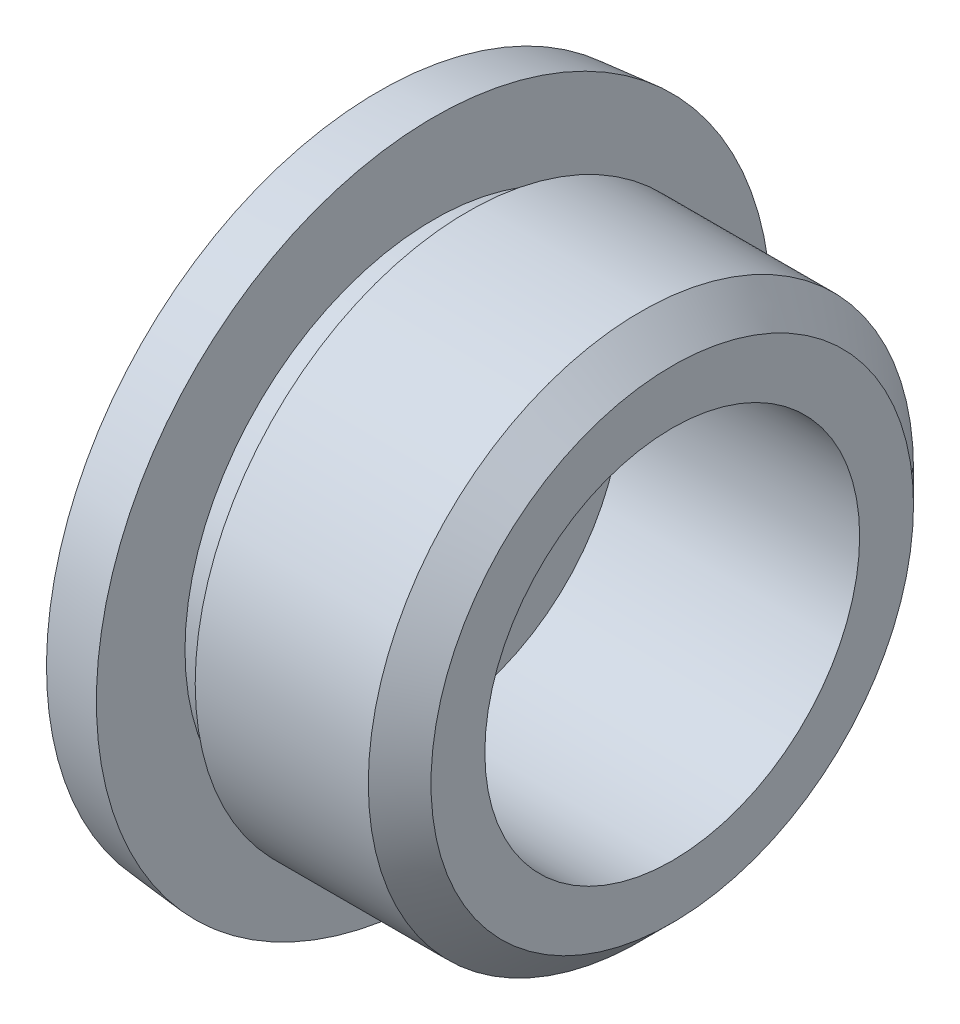
ISO-10303-21;
HEADER;
FILE_DESCRIPTION(('STEP AP214'),'2;1');
FILE_NAME('part.step','',(''),(''),'','','');
FILE_SCHEMA(('AUTOMOTIVE_DESIGN { 1 0 10303 214 1 1 1 1 }'));
ENDSEC;
DATA;
#1=APPLICATION_CONTEXT('core data for automotive mechanical design processes');
#2=APPLICATION_PROTOCOL_DEFINITION('international standard','automotive_design',2000,#1);
#3=PRODUCT_CONTEXT('',#1,'mechanical');
#4=PRODUCT('Part','Part','',(#3));
#5=PRODUCT_RELATED_PRODUCT_CATEGORY('part','',(#4));
#6=PRODUCT_DEFINITION_FORMATION('','',#4);
#7=PRODUCT_DEFINITION_CONTEXT('part definition',#1,'design');
#8=PRODUCT_DEFINITION('design','',#6,#7);
#9=PRODUCT_DEFINITION_SHAPE('','',#8);
#10=(LENGTH_UNIT() NAMED_UNIT(*) SI_UNIT(.MILLI.,.METRE.));
#11=(NAMED_UNIT(*) PLANE_ANGLE_UNIT() SI_UNIT($,.RADIAN.));
#12=(NAMED_UNIT(*) SI_UNIT($,.STERADIAN.) SOLID_ANGLE_UNIT());
#13=UNCERTAINTY_MEASURE_WITH_UNIT(LENGTH_MEASURE(1.E-05),#10,'distance_accuracy_value','');
#14=(GEOMETRIC_REPRESENTATION_CONTEXT(3) GLOBAL_UNCERTAINTY_ASSIGNED_CONTEXT((#13)) GLOBAL_UNIT_ASSIGNED_CONTEXT((#10,
#11,#12)) REPRESENTATION_CONTEXT('',''));
#15=CARTESIAN_POINT('',(0.,0.,0.));
#16=DIRECTION('',(0.,0.,1.));
#17=DIRECTION('',(1.,0.,0.));
#18=AXIS2_PLACEMENT_3D('',#15,#16,#17);
#19=CARTESIAN_POINT('',(25.0000000000068,-8.09248501543181E-13,0.));
#20=DIRECTION('',(1.,0.,0.));
#21=DIRECTION('',(0.,1.,0.));
#22=AXIS2_PLACEMENT_3D('',#19,#20,#21);
#23=SPHERICAL_SURFACE('',#22,35.0000000000068);
#24=CARTESIAN_POINT('',(-9.63740752423606,-0.500000000000008,5.));
#25=CARTESIAN_POINT('',(-9.63981327566375,-0.333342014793508,5.));
#26=CARTESIAN_POINT('',(-9.6410161513776,-0.166675348127109,5.));
#27=CARTESIAN_POINT('',(-9.6410161513776,0.166675348126021,5.));
#28=CARTESIAN_POINT('',(-9.63981327566374,0.333342014792958,5.));
#29=CARTESIAN_POINT('',(-9.63740752423603,0.499999999999996,5.));
#30=B_SPLINE_CURVE_WITH_KNOTS('',3,(#24,#25,#26,#27,#28,#29),.UNSPECIFIED.,.F.,.F.,(4,2,4),
(3.12715839564098,3.14159265358979,3.15602691153865),.UNSPECIFIED.);
#31=CARTESIAN_POINT('',(-9.63740752423607,-0.5,5.));
#32=VERTEX_POINT('',#31);
#33=CARTESIAN_POINT('',(-9.63740752423605,0.5,5.));
#34=VERTEX_POINT('',#33);
#35=EDGE_CURVE('E91',#32,#34,#30,.T.);
#36=ORIENTED_EDGE('',*,*,#35,.F.);
#37=CARTESIAN_POINT('',(-9.69510051863642,-0.999999999999999,4.50000000019122));
#38=CARTESIAN_POINT('',(-9.69425625040718,-1.00000006529905,4.50650932859504));
#39=CARTESIAN_POINT('',(-9.69341378455606,-0.999872888323441,4.51301888935069));
#40=CARTESIAN_POINT('',(-9.69173368959756,-0.999364463580699,4.52602870416813));
#41=CARTESIAN_POINT('',(-9.69089606048843,-0.998983215906208,4.53252895823331));
#42=CARTESIAN_POINT('',(-9.68922687187862,-0.997967064432838,4.54551038140945));
#43=CARTESIAN_POINT('',(-9.68839531236708,-0.997332161088237,4.55199155055457));
#44=CARTESIAN_POINT('',(-9.68673949592925,-0.995809575434961,4.56492504867621));
#45=CARTESIAN_POINT('',(-9.68591523898333,-0.994921893805845,4.57137737773021));
#46=CARTESIAN_POINT('',(-9.6842752606,-0.99289496692795,4.58424347450375));
#47=CARTESIAN_POINT('',(-9.68345953913741,-0.991755722421185,4.59065724233696));
#48=CARTESIAN_POINT('',(-9.68183786474035,-0.989227255250642,4.60343654303009));
#49=CARTESIAN_POINT('',(-9.68103191178179,-0.987838033203643,4.60980207600896));
#50=CARTESIAN_POINT('',(-9.67943100705672,-0.984811556093248,4.62247529361749));
#51=CARTESIAN_POINT('',(-9.67863605527774,-0.983174301311169,4.62878297831274));
#52=CARTESIAN_POINT('',(-9.67705838685718,-0.979654063820976,4.64133095930795));
#53=CARTESIAN_POINT('',(-9.67627567022977,-0.977771080828532,4.64757125552993));
#54=CARTESIAN_POINT('',(-9.67472370313987,-0.973762054175431,4.65997498975607));
#55=CARTESIAN_POINT('',(-9.67395445270483,-0.971636010019482,4.66613842760359));
#56=CARTESIAN_POINT('',(-9.67243070747204,-0.967143950675864,4.678378894743));
#57=CARTESIAN_POINT('',(-9.67167621229209,-0.964777941713751,4.68445592627194));
#58=CARTESIAN_POINT('',(-9.67018304166208,-0.95980937569266,4.69651427268231));
#59=CARTESIAN_POINT('',(-9.66944436574704,-0.957206825598449,4.70249559037586));
#60=CARTESIAN_POINT('',(-9.66798390572873,-0.951768929405653,4.7143533952469));
#61=CARTESIAN_POINT('',(-9.66726212126381,-0.948933588297169,4.7202298846682));
#62=CARTESIAN_POINT('',(-9.66583651180424,-0.943034205706543,4.73186905855125));
#63=CARTESIAN_POINT('',(-9.66513268659146,-0.939970167003871,4.73763174439503));
#64=CARTESIAN_POINT('',(-9.66374406462611,-0.933617823427196,4.74903448925447));
#65=CARTESIAN_POINT('',(-9.66305926784466,-0.930329518893538,4.7546745484562));
#66=CARTESIAN_POINT('',(-9.66170977058081,-0.923533411298078,4.76582338280248));
#67=CARTESIAN_POINT('',(-9.66104507031054,-0.920025605920577,4.77133215656115));
#68=CARTESIAN_POINT('',(-9.6597368368979,-0.912795591838756,4.78220993990732));
#69=CARTESIAN_POINT('',(-9.6590933042668,-0.909073377961649,4.78757894611826));
#70=CARTESIAN_POINT('',(-9.65782846583261,-0.90141996439581,4.79816890235774));
#71=CARTESIAN_POINT('',(-9.65720716090437,-0.897488756496561,4.80338984655716));
#72=CARTESIAN_POINT('',(-9.65598789544649,-0.889423195636813,4.81367544949314));
#73=CARTESIAN_POINT('',(-9.65538993558901,-0.885288836834814,4.81874010372883));
#74=CARTESIAN_POINT('',(-9.65421837050112,-0.876823449280919,4.82870476909937));
#75=CARTESIAN_POINT('',(-9.65364476405658,-0.872492430355895,4.83360478843958));
#76=CARTESIAN_POINT('',(-9.65252265411781,-0.863640208944243,4.84323251649939));
#77=CARTESIAN_POINT('',(-9.65197414956924,-0.859119014460857,4.84796023245452));
#78=CARTESIAN_POINT('',(-9.65090303136803,-0.849893188078305,4.85723597900052));
#79=CARTESIAN_POINT('',(-9.65038041707609,-0.845188560713695,4.8617840140276));
#80=CARTESIAN_POINT('',(-9.64936185540236,-0.835602899670582,4.87069328082037));
#81=CARTESIAN_POINT('',(-9.64886590786192,-0.830721867041878,4.8750545136974));
#82=CARTESIAN_POINT('',(-9.64790145831003,-0.820790701221015,4.88358332703785));
#83=CARTESIAN_POINT('',(-9.64743295669015,-0.81574056561784,4.88775090473819));
#84=CARTESIAN_POINT('',(-9.64652417871292,-0.805478764449239,4.89588583760548));
#85=CARTESIAN_POINT('',(-9.64608390337163,-0.800267093078999,4.89985318556366));
#86=CARTESIAN_POINT('',(-9.64523235019704,-0.789690046027472,4.90758137774001));
#87=CARTESIAN_POINT('',(-9.64482107408278,-0.784324661260706,4.91134220971325));
#88=CARTESIAN_POINT('',(-9.64402832000042,-0.773448255526343,4.91865138863502));
#89=CARTESIAN_POINT('',(-9.64364684453966,-0.767937222356359,4.92219971769826));
#90=CARTESIAN_POINT('',(-9.64291452765467,-0.756779987515788,4.92907688227806));
#91=CARTESIAN_POINT('',(-9.64256367778062,-0.751133823680066,4.93240577827538));
#92=CARTESIAN_POINT('',(-9.64189307354491,-0.739716341022641,4.93883822647942));
#93=CARTESIAN_POINT('',(-9.64157330430276,-0.733945083726809,4.94194188634037));
#94=CARTESIAN_POINT('',(-9.64096523235172,-0.722285089557511,4.94791991696799));
#95=CARTESIAN_POINT('',(-9.64067692232856,-0.716396380369748,4.95079434098986));
#96=CARTESIAN_POINT('',(-9.64013211206196,-0.704509228339795,4.95631010093332));
#97=CARTESIAN_POINT('',(-9.63987561233846,-0.698510783705751,4.95895143304469));
#98=CARTESIAN_POINT('',(-9.63939477307574,-0.68641198214126,4.96399735444876));
#99=CARTESIAN_POINT('',(-9.63917044213067,-0.680311598461163,4.96640188042321));
#100=CARTESIAN_POINT('',(-9.63875428844859,-0.668016823309242,4.970970676567));
#101=CARTESIAN_POINT('',(-9.63856248260284,-0.661822384800202,4.97313482169938));
#102=CARTESIAN_POINT('',(-9.63821172811189,-0.649347495063908,4.97721948375238));
#103=CARTESIAN_POINT('',(-9.63805280486026,-0.643066981326151,4.97913981194666));
#104=CARTESIAN_POINT('',(-9.63776816176221,-0.630428034850593,4.98273360808912));
#105=CARTESIAN_POINT('',(-9.63764247599443,-0.624069529080691,4.98440682189921));
#106=CARTESIAN_POINT('',(-9.63742465816906,-0.611282509912527,4.98750336830185));
#107=CARTESIAN_POINT('',(-9.63733257057521,-0.604853915255748,4.98892636848209));
#108=CARTESIAN_POINT('',(-9.63718234881359,-0.591934524830936,4.99151960655484));
#109=CARTESIAN_POINT('',(-9.63712427086009,-0.585443644004222,4.99268942396322));
#110=CARTESIAN_POINT('',(-9.637042056262,-0.572412551834939,4.99477268746107));
#111=CARTESIAN_POINT('',(-9.6370179610222,-0.565872290058695,4.99568581972121));
#112=CARTESIAN_POINT('',(-9.63700379527405,-0.552756297167026,4.99725287844416));
#113=CARTESIAN_POINT('',(-9.63701374761082,-0.546180545193489,4.99790663054065));
#114=CARTESIAN_POINT('',(-9.63706773427613,-0.533007605018115,4.99895305711112));
#115=CARTESIAN_POINT('',(-9.63711177290912,-0.526410414213753,4.99934569860022));
#116=CARTESIAN_POINT('',(-9.63723401461519,-0.51320873187845,4.99986915479854));
#117=CARTESIAN_POINT('',(-9.63731220340443,-0.506604244550177,5.00000007884758));
#118=CARTESIAN_POINT('',(-9.63740752423536,-0.500000000050684,4.99999999999996));
#119=B_SPLINE_CURVE_WITH_KNOTS('',3,(#37,#38,#39,#40,#41,#42,#43,#44,#45,#46,#47,#48,#49,#50,
#51,#52,#53,#54,#55,#56,#57,#58,#59,#60,#61,#62,#63,#64,#65,#66,#67,#68,#69,#70,#71,#72,#73,#74,
#75,#76,#77,#78,#79,#80,#81,#82,#83,#84,#85,#86,#87,#88,#89,#90,#91,#92,#93,#94,#95,#96,#97,#98,
#99,#100,#101,#102,#103,#104,#105,#106,#107,#108,#109,#110,#111,#112,#113,#114,#115,#116,#117,
#118),.UNSPECIFIED.,.F.,.F.,(4,2,2,2,2,2,2,2,2,2,2,2,2,2,2,2,2,2,2,2,2,2,2,2,2,2,2,2,2,2,2,2,2,
2,2,2,2,2,2,2,4),(0.,0.0196903202776409,0.039380633375157,0.0590709112088306,0.078761136108381,
0.0984513029301344,0.118141421170296,0.137831517078234,0.157521635769625,0.177211794584777,
0.196901442696451,0.216590511249746,0.23627915785897,0.255967565221772,0.27565594270612,
0.295344527934721,0.315033588366225,0.334723422872513,0.35441382388164,0.374103242065324,
0.393791832477795,0.413479936486441,0.433167923349381,0.452856191036952,0.472545167047633,
0.492235309217705,0.511927106285365,0.53161345295166,0.551290327467236,0.570962617328966,
0.590635228703609,0.610313086026817,0.630001131556556,0.649704324882489,0.669427642393108,
0.689176967822479,0.708958845291023,0.728764804389769,0.748584055424387,0.768405809655432,
0.788219281058291),.UNSPECIFIED.);
#120=CARTESIAN_POINT('',(-9.69510051866122,-1.,4.5));
#121=VERTEX_POINT('',#120);
#122=EDGE_CURVE('E79',#121,#32,#119,.T.);
#123=ORIENTED_EDGE('',*,*,#122,.F.);
#124=CARTESIAN_POINT('',(-9.69510051866118,-1.,-4.5));
#125=CARTESIAN_POINT('',(-9.88884108560159,-1.,-3.00625590121306));
#126=CARTESIAN_POINT('',(-9.9857113690718,-1.,-1.50625590121306));
#127=CARTESIAN_POINT('',(-9.9857113690718,-1.,1.50625590121306));
#128=CARTESIAN_POINT('',(-9.88884108560159,-1.,3.00625590121306));
#129=CARTESIAN_POINT('',(-9.69510051866118,-1.,4.5));
#130=B_SPLINE_CURVE_WITH_KNOTS('',3,(#124,#125,#126,#127,#128,#129),.UNSPECIFIED.,.F.,.F.,(4,2,
4),(1.44181505964026,1.5707963267949,1.69977759394954),.UNSPECIFIED.);
#131=CARTESIAN_POINT('',(-9.69510051866122,-1.,-4.5));
#132=VERTEX_POINT('',#131);
#133=EDGE_CURVE('E95',#132,#121,#130,.T.);
#134=ORIENTED_EDGE('',*,*,#133,.F.);
#135=CARTESIAN_POINT('',(-9.6374075242347,-0.500000000000038,-4.99999999999996));
#136=CARTESIAN_POINT('',(-9.63731277104187,-0.506563964563976,-5.00000007691213));
#137=CARTESIAN_POINT('',(-9.63723496527496,-0.513128169230701,-4.999870745952));
#138=CARTESIAN_POINT('',(-9.63711318464813,-0.526246132393621,-4.99935378556004));
#139=CARTESIAN_POINT('',(-9.6370692067935,-0.532799891763242,-4.99896617899846));
#140=CARTESIAN_POINT('',(-9.63701500292803,-0.545886809092196,-4.99793321567878));
#141=CARTESIAN_POINT('',(-9.63700477488075,-0.552419968270767,-4.99728787447488));
#142=CARTESIAN_POINT('',(-9.63701799046357,-0.565455568380148,-4.99574050269229));
#143=CARTESIAN_POINT('',(-9.63704143300549,-0.571958010296882,-4.99483848040991));
#144=CARTESIAN_POINT('',(-9.63712191018678,-0.584922107863202,-4.99277917259451));
#145=CARTESIAN_POINT('',(-9.63717894467586,-0.59138376369514,-4.99162188820358));
#146=CARTESIAN_POINT('',(-9.63732652498977,-0.604256286736955,-4.98905388424459));
#147=CARTESIAN_POINT('',(-9.63741707159157,-0.61066715276576,-4.98764315880095));
#148=CARTESIAN_POINT('',(-9.6376315995727,-0.623428174328837,-4.98457048944334));
#149=CARTESIAN_POINT('',(-9.63775558264556,-0.629778326771115,-4.98290853280649));
#150=CARTESIAN_POINT('',(-9.63803689144162,-0.642408095638793,-4.97933600547671));
#151=CARTESIAN_POINT('',(-9.63819421976281,-0.648687706528002,-4.97742541541674));
#152=CARTESIAN_POINT('',(-9.63854218030399,-0.661166505035479,-4.97335866500138));
#153=CARTESIAN_POINT('',(-9.63873281510801,-0.667365686373625,-4.97120248559682));
#154=CARTESIAN_POINT('',(-9.63914702772075,-0.679673061722857,-4.96664830601113));
#155=CARTESIAN_POINT('',(-9.63937060367585,-0.685781260832264,-4.96425031943898));
#156=CARTESIAN_POINT('',(-9.63985012713989,-0.697897128651814,-4.95921646038743));
#157=CARTESIAN_POINT('',(-9.64010607277855,-0.703904803147464,-4.95658060165454));
#158=CARTESIAN_POINT('',(-9.6406498181426,-0.715810407749626,-4.95107524818149));
#159=CARTESIAN_POINT('',(-9.64093761676805,-0.721708341637467,-4.94820576150983));
#160=CARTESIAN_POINT('',(-9.64154453729567,-0.733385431460395,-4.94223775589454));
#161=CARTESIAN_POINT('',(-9.64186365880764,-0.73916458887399,-4.93913923980404));
#162=CARTESIAN_POINT('',(-9.64253269772988,-0.750595285599569,-4.9327181254545));
#163=CARTESIAN_POINT('',(-9.64288261540067,-0.75624682383141,-4.9293955252998));
#164=CARTESIAN_POINT('',(-9.64361271924159,-0.767413648667125,-4.9225315311684));
#165=CARTESIAN_POINT('',(-9.64399290626632,-0.772928931418249,-4.91899013101482));
#166=CARTESIAN_POINT('',(-9.64478301841711,-0.7838148313534,-4.91169415474897));
#167=CARTESIAN_POINT('',(-9.64519294493736,-0.789185441738914,-4.90793956864423));
#168=CARTESIAN_POINT('',(-9.64604201803457,-0.799773814269035,-4.90022315925324));
#169=CARTESIAN_POINT('',(-9.64648116649389,-0.804991566535964,-4.89626132262037));
#170=CARTESIAN_POINT('',(-9.6473880862412,-0.81526591156352,-4.88813695686628));
#171=CARTESIAN_POINT('',(-9.64785585775849,-0.820322503032599,-4.88397442613738));
#172=CARTESIAN_POINT('',(-9.64881906484518,-0.830266551347629,-4.87545554582889));
#173=CARTESIAN_POINT('',(-9.64931449910687,-0.835154016171109,-4.87109920541331));
#174=CARTESIAN_POINT('',(-9.65033214633188,-0.844752497286065,-4.86219959654842));
#175=CARTESIAN_POINT('',(-9.6508543584383,-0.849463519215495,-4.85765633408164));
#176=CARTESIAN_POINT('',(-9.65192466403368,-0.858702080334872,-4.84839004089201));
#177=CARTESIAN_POINT('',(-9.65247275704623,-0.863229622899459,-4.84366701347857));
#178=CARTESIAN_POINT('',(-9.65359393065792,-0.8720944796052,-4.83404860850138));
#179=CARTESIAN_POINT('',(-9.65416701109613,-0.876431794971116,-4.82915323204765));
#180=CARTESIAN_POINT('',(-9.65533726405428,-0.884909749537635,-4.81919779371308));
#181=CARTESIAN_POINT('',(-9.65593443666957,-0.88905038795963,-4.81413773118043));
#182=CARTESIAN_POINT('',(-9.65715198217051,-0.897128847273778,-4.80386082066884));
#183=CARTESIAN_POINT('',(-9.65777235535413,-0.901066665559472,-4.79864397067638));
#184=CARTESIAN_POINT('',(-9.65903539746182,-0.908733658713315,-4.78806160694129));
#185=CARTESIAN_POINT('',(-9.65967806683789,-0.912462829347659,-4.78269609018526));
#186=CARTESIAN_POINT('',(-9.66098479720044,-0.919706760402931,-4.77182512121643));
#187=CARTESIAN_POINT('',(-9.66164885720675,-0.923221530626861,-4.76631967541792));
#188=CARTESIAN_POINT('',(-9.6629969431483,-0.930030217395032,-4.75517956188308));
#189=CARTESIAN_POINT('',(-9.66368096033667,-0.933324228667277,-4.7495449509828));
#190=CARTESIAN_POINT('',(-9.66506791853393,-0.939687253885697,-4.73815470181056));
#191=CARTESIAN_POINT('',(-9.66577085357618,-0.942756337662383,-4.73239910182083));
#192=CARTESIAN_POINT('',(-9.66719466921088,-0.948665886467429,-4.72077461578409));
#193=CARTESIAN_POINT('',(-9.66791554801332,-0.951506374181158,-4.71490574105007));
#194=CARTESIAN_POINT('',(-9.66937427230262,-0.956955267051686,-4.70306249507446));
#195=CARTESIAN_POINT('',(-9.67011211967652,-0.959563646237526,-4.6970881121168));
#196=CARTESIAN_POINT('',(-9.67160380312127,-0.964545011671489,-4.68504169355398));
#197=CARTESIAN_POINT('',(-9.67235764425614,-0.966917921972261,-4.67896962717143));
#198=CARTESIAN_POINT('',(-9.6738803373259,-0.971425189524726,-4.66673574611351));
#199=CARTESIAN_POINT('',(-9.67464919700225,-0.973559419719333,-4.66057388559191));
#200=CARTESIAN_POINT('',(-9.67620095102578,-0.977586314928434,-4.64816838797042));
#201=CARTESIAN_POINT('',(-9.67698385529491,-0.979478800825686,-4.64192469397056));
#202=CARTESIAN_POINT('',(-9.67856271820882,-0.983019342162114,-4.62936357481892));
#203=CARTESIAN_POINT('',(-9.67935868845682,-0.984667165653447,-4.62304608574906));
#204=CARTESIAN_POINT('',(-9.6809628180079,-0.987715847391021,-4.6103447367161));
#205=CARTESIAN_POINT('',(-9.68177099147673,-0.989116390087548,-4.60396080280257));
#206=CARTESIAN_POINT('',(-9.68339828933468,-0.991667605311439,-4.59113597943397));
#207=CARTESIAN_POINT('',(-9.68421742639107,-0.992817956446248,-4.58469502765322));
#208=CARTESIAN_POINT('',(-9.68586504741001,-0.994865783630317,-4.5717684812532));
#209=CARTESIAN_POINT('',(-9.68669353879217,-0.995763041769939,-4.56528285305933));
#210=CARTESIAN_POINT('',(-9.68835826917983,-0.997302465774662,-4.55227946120207));
#211=CARTESIAN_POINT('',(-9.68919451141449,-0.997944519932422,-4.54576168472776));
#212=CARTESIAN_POINT('',(-9.69087314061317,-0.998972088709345,-4.53270662361423));
#213=CARTESIAN_POINT('',(-9.69171552767637,-0.999357599178613,-4.52616933866114));
#214=CARTESIAN_POINT('',(-9.69340484461117,-0.999871536147144,-4.51308795503908));
#215=CARTESIAN_POINT('',(-9.6942517725036,-1.00000006676009,-4.50654386020467));
#216=CARTESIAN_POINT('',(-9.69510051865333,-1.,-4.50000000006086));
#217=B_SPLINE_CURVE_WITH_KNOTS('',3,(#135,#136,#137,#138,#139,#140,#141,#142,#143,#144,#145,
#146,#147,#148,#149,#150,#151,#152,#153,#154,#155,#156,#157,#158,#159,#160,#161,#162,#163,#164,
#165,#166,#167,#168,#169,#170,#171,#172,#173,#174,#175,#176,#177,#178,#179,#180,#181,#182,#183,
#184,#185,#186,#187,#188,#189,#190,#191,#192,#193,#194,#195,#196,#197,#198,#199,#200,#201,#202,
#203,#204,#205,#206,#207,#208,#209,#210,#211,#212,#213,#214,#215,#216),.UNSPECIFIED.,.F.,.F.,(4,
2,2,2,2,2,2,2,2,2,2,2,2,2,2,2,2,2,2,2,2,2,2,2,2,2,2,2,2,2,2,2,2,2,2,2,2,2,2,2,4),(0.,
0.0196926429646662,0.0393835423821486,0.0590732536398859,0.0787623285692141,0.0984513154070089,
0.118140758758321,0.137831199560027,0.157523175045485,0.177216678981782,0.196909075180842,
0.216600334095412,0.236290913247631,0.25598124714631,0.27567174763752,0.295362804260076,
0.31505478460553,0.33474803465047,0.354441442478171,0.374133920118487,0.393825767979081,
0.413517253493452,0.433208612207305,0.452900048869105,0.472591738524105,0.492283827611242,
0.511975015643729,0.531657699328988,0.551334246254693,0.571008838109244,0.590685628621613,
0.610368745132079,0.630062290217596,0.649770343366257,0.669496962695211,0.68924857561287,
0.709025413245157,0.728819226851449,0.748621695047495,0.768424483563975,0.788219247485347),.UNSPECIFIED.);
#218=CARTESIAN_POINT('',(-9.63740752423607,-0.5,-5.));
#219=VERTEX_POINT('',#218);
#220=EDGE_CURVE('E163',#219,#132,#217,.T.);
#221=ORIENTED_EDGE('',*,*,#220,.F.);
#222=CARTESIAN_POINT('',(-9.63740752423603,0.499999999999994,-5.));
#223=CARTESIAN_POINT('',(-9.63981327566374,0.33334201479296,-5.));
#224=CARTESIAN_POINT('',(-9.6410161513776,0.166675348126029,-5.));
#225=CARTESIAN_POINT('',(-9.6410161513776,-0.166675348127097,-5.));
#226=CARTESIAN_POINT('',(-9.63981327566375,-0.333342014793495,-5.));
#227=CARTESIAN_POINT('',(-9.63740752423606,-0.499999999999995,-5.));
#228=B_SPLINE_CURVE_WITH_KNOTS('',3,(#222,#223,#224,#225,#226,#227),.UNSPECIFIED.,.F.,.F.,(4,2,
4),(6.26875104923073,6.28318530717959,6.2976195651284),.UNSPECIFIED.);
#229=CARTESIAN_POINT('',(-9.63740752423606,0.5,-5.));
#230=VERTEX_POINT('',#229);
#231=EDGE_CURVE('E167',#230,#219,#228,.T.);
#232=ORIENTED_EDGE('',*,*,#231,.F.);
#233=CARTESIAN_POINT('',(-9.69510051863638,0.999999999999999,-4.50000000019118));
#234=CARTESIAN_POINT('',(-9.69425625040714,1.00000006529905,-4.506509328595));
#235=CARTESIAN_POINT('',(-9.69341378455601,0.999872888323442,-4.51301888935065));
#236=CARTESIAN_POINT('',(-9.69173368959752,0.9993644635807,-4.52602870416809));
#237=CARTESIAN_POINT('',(-9.69089606048838,0.998983215906211,-4.53252895823327));
#238=CARTESIAN_POINT('',(-9.68922687187858,0.997967064432841,-4.54551038140942));
#239=CARTESIAN_POINT('',(-9.68839531236704,0.99733216108824,-4.55199155055454));
#240=CARTESIAN_POINT('',(-9.6867394959292,0.995809575434964,-4.56492504867618));
#241=CARTESIAN_POINT('',(-9.68591523898329,0.994921893805849,-4.57137737773018));
#242=CARTESIAN_POINT('',(-9.68427526059995,0.992894966927955,-4.58424347450372));
#243=CARTESIAN_POINT('',(-9.68345953913737,0.99175572242119,-4.59065724233694));
#244=CARTESIAN_POINT('',(-9.68183786474031,0.989227255250647,-4.60343654303006));
#245=CARTESIAN_POINT('',(-9.68103191178174,0.987838033203648,-4.60980207600894));
#246=CARTESIAN_POINT('',(-9.67943100705667,0.984811556093253,-4.62247529361747));
#247=CARTESIAN_POINT('',(-9.6786360552777,0.983174301311174,-4.62878297831272));
#248=CARTESIAN_POINT('',(-9.67705838685714,0.979654063820981,-4.64133095930793));
#249=CARTESIAN_POINT('',(-9.67627567022972,0.977771080828537,-4.64757125552992));
#250=CARTESIAN_POINT('',(-9.67472370313982,0.973762054175436,-4.65997498975606));
#251=CARTESIAN_POINT('',(-9.67395445270479,0.971636010019488,-4.66613842760357));
#252=CARTESIAN_POINT('',(-9.672430707472,0.96714395067587,-4.67837889474299));
#253=CARTESIAN_POINT('',(-9.67167621229204,0.964777941713756,-4.68445592627192));
#254=CARTESIAN_POINT('',(-9.67018304166204,0.959809375692666,-4.69651427268229));
#255=CARTESIAN_POINT('',(-9.66944436574699,0.957206825598454,-4.70249559037585));
#256=CARTESIAN_POINT('',(-9.66798390572869,0.951768929405658,-4.71435339524689));
#257=CARTESIAN_POINT('',(-9.66726212126377,0.948933588297173,-4.72022988466819));
#258=CARTESIAN_POINT('',(-9.6658365118042,0.943034205706547,-4.73186905855124));
#259=CARTESIAN_POINT('',(-9.66513268659142,0.939970167003875,-4.73763174439503));
#260=CARTESIAN_POINT('',(-9.66374406462607,0.933617823427198,-4.74903448925446));
#261=CARTESIAN_POINT('',(-9.66305926784462,0.93032951889354,-4.75467454845619));
#262=CARTESIAN_POINT('',(-9.66170977058077,0.923533411298079,-4.76582338280248));
#263=CARTESIAN_POINT('',(-9.6610450703105,0.920025605920578,-4.77133215656115));
#264=CARTESIAN_POINT('',(-9.65973683689786,0.912795591838756,-4.78220993990732));
#265=CARTESIAN_POINT('',(-9.65909330426676,0.909073377961648,-4.78757894611826));
#266=CARTESIAN_POINT('',(-9.65782846583258,0.901419964395809,-4.79816890235775));
#267=CARTESIAN_POINT('',(-9.65720716090433,0.897488756496559,-4.80338984655716));
#268=CARTESIAN_POINT('',(-9.65598789544645,0.889423195636811,-4.81367544949314));
#269=CARTESIAN_POINT('',(-9.65538993558897,0.885288836834811,-4.81874010372884));
#270=CARTESIAN_POINT('',(-9.65421837050109,0.876823449280915,-4.82870476909937));
#271=CARTESIAN_POINT('',(-9.65364476405654,0.872492430355892,-4.83360478843958));
#272=CARTESIAN_POINT('',(-9.65252265411777,0.86364020894424,-4.8432325164994));
#273=CARTESIAN_POINT('',(-9.6519741495692,0.859119014460853,-4.84796023245453));
#274=CARTESIAN_POINT('',(-9.65090303136799,0.849893188078302,-4.85723597900052));
#275=CARTESIAN_POINT('',(-9.65038041707605,0.845188560713691,-4.8617840140276));
#276=CARTESIAN_POINT('',(-9.64936185540233,0.835602899670579,-4.87069328082037));
#277=CARTESIAN_POINT('',(-9.64886590786189,0.830721867041875,-4.8750545136974));
#278=CARTESIAN_POINT('',(-9.64790145830999,0.820790701221012,-4.88358332703786));
#279=CARTESIAN_POINT('',(-9.64743295669012,0.815740565617838,-4.88775090473819));
#280=CARTESIAN_POINT('',(-9.64652417871288,0.805478764449237,-4.89588583760549));
#281=CARTESIAN_POINT('',(-9.64608390337159,0.800267093078998,-4.89985318556366));
#282=CARTESIAN_POINT('',(-9.64523235019701,0.789690046027471,-4.90758137774001));
#283=CARTESIAN_POINT('',(-9.64482107408275,0.784324661260705,-4.91134220971325));
#284=CARTESIAN_POINT('',(-9.64402832000038,0.773448255526342,-4.91865138863502));
#285=CARTESIAN_POINT('',(-9.64364684453962,0.767937222356358,-4.92219971769826));
#286=CARTESIAN_POINT('',(-9.64291452765464,0.756779987515925,-4.92907688227797));
#287=CARTESIAN_POINT('',(-9.64256367778059,0.751133823680344,-4.93240577827522));
#288=CARTESIAN_POINT('',(-9.64189307354489,0.739716341023412,-4.93883822647899));
#289=CARTESIAN_POINT('',(-9.64157330430275,0.733945083727936,-4.94194188633977));
#290=CARTESIAN_POINT('',(-9.64096523235172,0.722285089559459,-4.94791991696702));
#291=CARTESIAN_POINT('',(-9.64067692232857,0.716396380372164,-4.95079434098869));
#292=CARTESIAN_POINT('',(-9.64013211206197,0.704509228343144,-4.95631010093182));
#293=CARTESIAN_POINT('',(-9.63987561233848,0.698510783709566,-4.95895143304303));
#294=CARTESIAN_POINT('',(-9.63939477307578,0.686411982145884,-4.9639973544469));
#295=CARTESIAN_POINT('',(-9.63917044213071,0.680311598466127,-4.96640188042128));
#296=CARTESIAN_POINT('',(-9.63875428844864,0.668016823314639,-4.97097067656507));
#297=CARTESIAN_POINT('',(-9.63856248260289,0.661822384805688,-4.9731348216975));
#298=CARTESIAN_POINT('',(-9.63821172811193,0.649347495069189,-4.97721948375073));
#299=CARTESIAN_POINT('',(-9.6380528048603,0.643066981331135,-4.97913981194518));
#300=CARTESIAN_POINT('',(-9.63776816176223,0.630428034854465,-4.98273360808809));
#301=CARTESIAN_POINT('',(-9.63764247599444,0.624069529083744,-4.98440682189844));
#302=CARTESIAN_POINT('',(-9.63742465816904,0.611282509913256,-4.9875033683017));
#303=CARTESIAN_POINT('',(-9.63733257057517,0.604853915254967,-4.98892636848228));
#304=CARTESIAN_POINT('',(-9.63718234881351,0.591934524826204,-4.99151960655576));
#305=CARTESIAN_POINT('',(-9.63712427086,0.585443643997042,-4.9926894239645));
#306=CARTESIAN_POINT('',(-9.6370420562619,0.572412551822157,-4.99477268746299));
#307=CARTESIAN_POINT('',(-9.63701796102211,0.565872290042755,-4.99568581972337));
#308=CARTESIAN_POINT('',(-9.63700379527398,0.552756297144377,-4.99725287844661));
#309=CARTESIAN_POINT('',(-9.63701374761077,0.546180545167287,-4.99790663054313));
#310=CARTESIAN_POINT('',(-9.63706773427615,0.533007604984744,-4.99895305711337));
#311=CARTESIAN_POINT('',(-9.63711177290918,0.526410414176765,-4.99934569860223));
#312=CARTESIAN_POINT('',(-9.63723401461536,0.513208731834492,-4.99986915479975));
#313=CARTESIAN_POINT('',(-9.63731220340467,0.506604244502868,-5.00000007884825));
#314=CARTESIAN_POINT('',(-9.63740752423569,0.500000000000038,-4.99999999999996));
#315=B_SPLINE_CURVE_WITH_KNOTS('',3,(#233,#234,#235,#236,#237,#238,#239,#240,#241,#242,#243,
#244,#245,#246,#247,#248,#249,#250,#251,#252,#253,#254,#255,#256,#257,#258,#259,#260,#261,#262,
#263,#264,#265,#266,#267,#268,#269,#270,#271,#272,#273,#274,#275,#276,#277,#278,#279,#280,#281,
#282,#283,#284,#285,#286,#287,#288,#289,#290,#291,#292,#293,#294,#295,#296,#297,#298,#299,#300,
#301,#302,#303,#304,#305,#306,#307,#308,#309,#310,#311,#312,#313,#314),.UNSPECIFIED.,.F.,.F.,(4,
2,2,2,2,2,2,2,2,2,2,2,2,2,2,2,2,2,2,2,2,2,2,2,2,2,2,2,2,2,2,2,2,2,2,2,2,2,2,2,4),(0.,
0.0196903202776439,0.0393806333751614,0.0590709112088383,0.0787611361083912,0.0984513029301462,
0.11814142117031,0.137831517078252,0.157521635769644,0.177211794584798,0.196901442696474,
0.216590511249771,0.236279157859,0.255967565221804,0.275655942706154,0.295344527934758,
0.315033588366264,0.334723422872553,0.354413823881682,0.374103242065365,0.393791832477836,
0.413479936486483,0.433167923349422,0.452856191036991,0.472545167047671,0.492235309217742,
0.511927106285402,0.531613452951212,0.5512903274656,0.570962617325817,0.590635228699004,
0.610313086021193,0.630001131550731,0.649704324877662,0.669427642390857,0.689176967824866,
0.708958845300823,0.728764804409049,0.74858405545427,0.768405809696096,0.788219281108969),.UNSPECIFIED.);
#316=CARTESIAN_POINT('',(-9.69510051866117,1.,-4.5));
#317=VERTEX_POINT('',#316);
#318=EDGE_CURVE('E172',#317,#230,#315,.T.);
#319=ORIENTED_EDGE('',*,*,#318,.F.);
#320=CARTESIAN_POINT('',(-9.69510051866114,1.,4.5));
#321=CARTESIAN_POINT('',(-9.88884108560155,1.,3.00625590121306));
#322=CARTESIAN_POINT('',(-9.98571136907175,1.,1.50625590121306));
#323=CARTESIAN_POINT('',(-9.98571136907175,1.,-1.50625590121306));
#324=CARTESIAN_POINT('',(-9.88884108560155,1.,-3.00625590121306));
#325=CARTESIAN_POINT('',(-9.69510051866114,1.,-4.49999999999999));
#326=B_SPLINE_CURVE_WITH_KNOTS('',3,(#320,#321,#322,#323,#324,#325),.UNSPECIFIED.,.F.,.F.,(4,2,
4),(1.44181505964026,1.5707963267949,1.69977759394954),.UNSPECIFIED.);
#327=CARTESIAN_POINT('',(-9.69510051866117,1.,4.5));
#328=VERTEX_POINT('',#327);
#329=EDGE_CURVE('E302',#328,#317,#326,.T.);
#330=ORIENTED_EDGE('',*,*,#329,.F.);
#331=CARTESIAN_POINT('',(-9.63740752423332,0.500000000190037,4.99999999999996));
#332=CARTESIAN_POINT('',(-9.63731277104076,0.506563964746132,5.00000007690964));
#333=CARTESIAN_POINT('',(-9.63723496527409,0.513128169404964,4.99987074594732));
#334=CARTESIAN_POINT('',(-9.63711318464767,0.526246132551468,4.99935378555163));
#335=CARTESIAN_POINT('',(-9.63706920679322,0.532799891912568,4.99896617898853));
#336=CARTESIAN_POINT('',(-9.63701500292805,0.5458868092242,4.9979332156665));
#337=CARTESIAN_POINT('',(-9.63700477488089,0.552419968393972,4.99728787446178));
#338=CARTESIAN_POINT('',(-9.63701799046391,0.565455568485829,4.99574050267822));
#339=CARTESIAN_POINT('',(-9.6370414330059,0.571958010393837,4.9948384803957));
#340=CARTESIAN_POINT('',(-9.63712191018729,0.584922107943124,4.99277917258062));
#341=CARTESIAN_POINT('',(-9.63717894467641,0.591383763766753,4.99162188819016));
#342=CARTESIAN_POINT('',(-9.63732652499033,0.604256286792704,4.98905388423261));
#343=CARTESIAN_POINT('',(-9.63741707159212,0.610667152813949,4.98764315878991));
#344=CARTESIAN_POINT('',(-9.63763159957318,0.62342817436298,4.98457048943456));
#345=CARTESIAN_POINT('',(-9.637755582646,0.629778326798762,4.98290853279897));
#346=CARTESIAN_POINT('',(-9.63803689144194,0.642408095654825,4.97933600547187));
#347=CARTESIAN_POINT('',(-9.63819421976305,0.648687706538899,4.97742541541328));
#348=CARTESIAN_POINT('',(-9.63854218030404,0.661166505037746,4.97335866500055));
#349=CARTESIAN_POINT('',(-9.63873281510795,0.667365686372377,4.97120248559721));
#350=CARTESIAN_POINT('',(-9.63914702772051,0.67967306171617,4.96664830601368));
#351=CARTESIAN_POINT('',(-9.63937060367555,0.68578126082363,4.9642503194424));
#352=CARTESIAN_POINT('',(-9.63985012713951,0.697897128640548,4.95921646039227));
#353=CARTESIAN_POINT('',(-9.64010607277815,0.703904803135492,4.95658060165988));
#354=CARTESIAN_POINT('',(-9.64064981814217,0.715810407737165,4.95107524818746));
#355=CARTESIAN_POINT('',(-9.64093761676763,0.721708341625206,4.9482057615159));
#356=CARTESIAN_POINT('',(-9.64154453729527,0.733385431449131,4.9422377559005));
#357=CARTESIAN_POINT('',(-9.64186365880727,0.739164588863512,4.93913923980976));
#358=CARTESIAN_POINT('',(-9.64253269772956,0.75059528559095,4.93271812545951));
#359=CARTESIAN_POINT('',(-9.64288261540039,0.756246823823857,4.92939552530432));
#360=CARTESIAN_POINT('',(-9.64361271924137,0.767413648661701,4.92253153117185));
#361=CARTESIAN_POINT('',(-9.64399290626614,0.772928931413888,4.91899013101768));
#362=CARTESIAN_POINT('',(-9.64478301841698,0.783814831350897,4.91169415475071));
#363=CARTESIAN_POINT('',(-9.64519294493725,0.789185441737213,4.90793956864545));
#364=CARTESIAN_POINT('',(-9.64604201803451,0.799773814268432,4.9002231592537));
#365=CARTESIAN_POINT('',(-9.64648116649383,0.804991566535671,4.8962613226206));
#366=CARTESIAN_POINT('',(-9.64738808624116,0.815265911563528,4.88813695686628));
#367=CARTESIAN_POINT('',(-9.64785585775845,0.820322503032607,4.88397442613737));
#368=CARTESIAN_POINT('',(-9.64881906484515,0.830266551347637,4.87545554582888));
#369=CARTESIAN_POINT('',(-9.64931449910683,0.835154016171117,4.87109920541331));
#370=CARTESIAN_POINT('',(-9.65033214633184,0.844752497286072,4.86219959654841));
#371=CARTESIAN_POINT('',(-9.65085435843826,0.849463519215502,4.85765633408164));
#372=CARTESIAN_POINT('',(-9.65192466403364,0.858702080334879,4.84839004089201));
#373=CARTESIAN_POINT('',(-9.65247275704619,0.863229622899465,4.84366701347857));
#374=CARTESIAN_POINT('',(-9.65359393065788,0.872094479605205,4.83404860850138));
#375=CARTESIAN_POINT('',(-9.6541670110961,0.876431794971121,4.82915323204764));
#376=CARTESIAN_POINT('',(-9.65533726405424,0.884909749537639,4.81919779371308));
#377=CARTESIAN_POINT('',(-9.65593443666953,0.889050387959634,4.81413773118042));
#378=CARTESIAN_POINT('',(-9.65715198217047,0.897128847273781,4.80386082066883));
#379=CARTESIAN_POINT('',(-9.65777235535409,0.901066665559474,4.79864397067638));
#380=CARTESIAN_POINT('',(-9.65903539746178,0.908733658713317,4.78806160694128));
#381=CARTESIAN_POINT('',(-9.65967806683785,0.91246282934766,4.78269609018525));
#382=CARTESIAN_POINT('',(-9.6609847972004,0.919706760402931,4.77182512121643));
#383=CARTESIAN_POINT('',(-9.66164885720671,0.92322153062686,4.76631967541792));
#384=CARTESIAN_POINT('',(-9.66299694314826,0.93003021739503,4.75517956188308));
#385=CARTESIAN_POINT('',(-9.66368096033663,0.933324228667276,4.7495449509828));
#386=CARTESIAN_POINT('',(-9.66506791853389,0.939687253885695,4.73815470181056));
#387=CARTESIAN_POINT('',(-9.66577085357614,0.94275633766238,4.73239910182083));
#388=CARTESIAN_POINT('',(-9.66719466921084,0.948665886467426,4.7207746157841));
#389=CARTESIAN_POINT('',(-9.66791554801327,0.951506374181154,4.71490574105008));
#390=CARTESIAN_POINT('',(-9.66937427230257,0.956955267051682,4.70306249507447));
#391=CARTESIAN_POINT('',(-9.67011211967647,0.959563646237521,4.69708811211682));
#392=CARTESIAN_POINT('',(-9.67160380312122,0.964545011671484,4.68504169355399));
#393=CARTESIAN_POINT('',(-9.67235764425608,0.966917921972255,4.67896962717144));
#394=CARTESIAN_POINT('',(-9.67388033732585,0.97142518952472,4.66673574611353));
#395=CARTESIAN_POINT('',(-9.6746491970022,0.973559419719327,4.66057388559193));
#396=CARTESIAN_POINT('',(-9.67620095102573,0.977586314928428,4.64816838797043));
#397=CARTESIAN_POINT('',(-9.67698385529485,0.97947880082568,4.64192469397058));
#398=CARTESIAN_POINT('',(-9.67856271820877,0.983019342162108,4.62936357481894));
#399=CARTESIAN_POINT('',(-9.67935868845676,0.984667165653442,4.62304608574908));
#400=CARTESIAN_POINT('',(-9.68096281800784,0.987715847391016,4.61034473671613));
#401=CARTESIAN_POINT('',(-9.68177099147668,0.989116390087543,4.60396080280259));
#402=CARTESIAN_POINT('',(-9.68339828933463,0.991667605311434,4.59113597943399));
#403=CARTESIAN_POINT('',(-9.68421742639102,0.992817956446244,4.58469502765324));
#404=CARTESIAN_POINT('',(-9.68586504740995,0.994865783630314,4.57176848125322));
#405=CARTESIAN_POINT('',(-9.68669353879212,0.995763041769936,4.56528285305935));
#406=CARTESIAN_POINT('',(-9.68835826917978,0.99730246577466,4.55227946120209));
#407=CARTESIAN_POINT('',(-9.68919451141444,0.99794451993242,4.54576168472778));
#408=CARTESIAN_POINT('',(-9.69087314061312,0.998972088709344,4.53270662361425));
#409=CARTESIAN_POINT('',(-9.69171552767632,0.999357599178613,4.52616933866116));
#410=CARTESIAN_POINT('',(-9.69340484461113,0.999871536147143,4.5130879550391));
#411=CARTESIAN_POINT('',(-9.69425177250355,1.00000006676009,4.50654386020469));
#412=CARTESIAN_POINT('',(-9.69510051865328,1.,4.50000000006088));
#413=B_SPLINE_CURVE_WITH_KNOTS('',3,(#331,#332,#333,#334,#335,#336,#337,#338,#339,#340,#341,
#342,#343,#344,#345,#346,#347,#348,#349,#350,#351,#352,#353,#354,#355,#356,#357,#358,#359,#360,
#361,#362,#363,#364,#365,#366,#367,#368,#369,#370,#371,#372,#373,#374,#375,#376,#377,#378,#379,
#380,#381,#382,#383,#384,#385,#386,#387,#388,#389,#390,#391,#392,#393,#394,#395,#396,#397,#398,
#399,#400,#401,#402,#403,#404,#405,#406,#407,#408,#409,#410,#411,#412),.UNSPECIFIED.,.F.,.F.,(4,
2,2,2,2,2,2,2,2,2,2,2,2,2,2,2,2,2,2,2,2,2,2,2,2,2,2,2,2,2,2,2,2,2,2,2,2,2,2,2,4),(0.,
0.0196926429411319,0.0393835423333795,0.059073253565111,0.0787623284685912,0.0984513152816256,
0.118140758610196,0.137831199392106,0.157523174861644,0.177216678786787,0.196909074979451,
0.216600333891491,0.236290913044113,0.255981246945204,0.275671747439905,0.295362804066099,
0.315054784414412,0.334748034460503,0.354441442288205,0.374133919928521,0.393825767789114,
0.413517253303484,0.433208612017336,0.452900048679133,0.472591738334132,0.492283827421266,
0.511975015453751,0.531657699139007,0.551334246064709,0.571008837919257,0.590685628431622,
0.610368744942085,0.630062290027599,0.649770343176257,0.66949696250521,0.689248575422869,
0.709025413055156,0.728819226661449,0.748621694857497,0.768424483373979,0.788219247295351),.UNSPECIFIED.);
#414=EDGE_CURVE('E108',#34,#328,#413,.T.);
#415=ORIENTED_EDGE('',*,*,#414,.F.);
#416=EDGE_LOOP('',(#36,#123,#134,#221,#232,#319,#330,#415));
#417=FACE_BOUND('',#416,.T.);
#418=CARTESIAN_POINT('',(-8.6145429836552,0.,0.));
#419=DIRECTION('',(1.,0.,0.));
#420=DIRECTION('',(0.,0.,-1.));
#421=AXIS2_PLACEMENT_3D('',#418,#419,#420);
#422=CIRCLE('',#421,9.75);
#423=CARTESIAN_POINT('',(-8.6145429836552,0.,-9.75));
#424=VERTEX_POINT('',#423);
#425=EDGE_CURVE('E299',#424,#424,#422,.T.);
#426=ORIENTED_EDGE('',*,*,#425,.F.);
#427=EDGE_LOOP('',(#426));
#428=FACE_BOUND('',#427,.T.);
#429=ADVANCED_FACE('F17',(#417,#428),#23,.T.);
#430=CARTESIAN_POINT('',(-8.6145429836552,0.,0.));
#431=DIRECTION('',(1.,0.,0.));
#432=DIRECTION('',(0.,0.,-1.));
#433=AXIS2_PLACEMENT_3D('',#430,#431,#432);
#434=CONICAL_SURFACE('',#433,9.75,0.092639620524633);
#435=CARTESIAN_POINT('',(-7.,0.,0.));
#436=DIRECTION('',(1.,0.,0.));
#437=DIRECTION('',(0.,0.,-1.));
#438=AXIS2_PLACEMENT_3D('',#435,#436,#437);
#439=CIRCLE('',#438,9.9);
#440=CARTESIAN_POINT('',(-7.,0.,-9.9));
#441=VERTEX_POINT('',#440);
#442=EDGE_CURVE('E379',#441,#441,#439,.T.);
#443=ORIENTED_EDGE('',*,*,#442,.F.);
#444=EDGE_LOOP('',(#443));
#445=FACE_BOUND('',#444,.T.);
#446=ORIENTED_EDGE('',*,*,#425,.T.);
#447=EDGE_LOOP('',(#446));
#448=FACE_BOUND('',#447,.T.);
#449=ADVANCED_FACE('F122',(#445,#448),#434,.T.);
#450=CARTESIAN_POINT('',(-7.,9.9,0.));
#451=DIRECTION('',(-1.,0.,0.));
#452=DIRECTION('',(0.,0.,1.));
#453=AXIS2_PLACEMENT_3D('',#450,#451,#452);
#454=PLANE('',#453);
#455=CARTESIAN_POINT('',(-7.,0.,0.));
#456=DIRECTION('',(1.,0.,0.));
#457=DIRECTION('',(0.,0.,-1.));
#458=AXIS2_PLACEMENT_3D('',#455,#456,#457);
#459=CIRCLE('',#458,7.3);
#460=CARTESIAN_POINT('',(-7.,0.,-7.3));
#461=VERTEX_POINT('',#460);
#462=EDGE_CURVE('E380',#461,#461,#459,.T.);
#463=ORIENTED_EDGE('',*,*,#462,.F.);
#464=EDGE_LOOP('',(#463));
#465=FACE_BOUND('',#464,.T.);
#466=ORIENTED_EDGE('',*,*,#442,.T.);
#467=EDGE_LOOP('',(#466));
#468=FACE_BOUND('',#467,.T.);
#469=ADVANCED_FACE('F364',(#465,#468),#454,.F.);
#470=CARTESIAN_POINT('',(0.,0.,0.));
#471=DIRECTION('',(1.,0.,0.));
#472=DIRECTION('',(0.,0.,-1.));
#473=AXIS2_PLACEMENT_3D('',#470,#471,#472);
#474=CYLINDRICAL_SURFACE('',#473,7.3);
#475=CARTESIAN_POINT('',(-6.,0.,0.));
#476=DIRECTION('',(1.,0.,0.));
#477=DIRECTION('',(0.,0.,-1.));
#478=AXIS2_PLACEMENT_3D('',#475,#476,#477);
#479=CIRCLE('',#478,7.3);
#480=CARTESIAN_POINT('',(-6.,0.,-7.3));
#481=VERTEX_POINT('',#480);
#482=EDGE_CURVE('E385',#481,#481,#479,.T.);
#483=ORIENTED_EDGE('',*,*,#482,.F.);
#484=EDGE_LOOP('',(#483));
#485=FACE_BOUND('',#484,.T.);
#486=ORIENTED_EDGE('',*,*,#462,.T.);
#487=EDGE_LOOP('',(#486));
#488=FACE_BOUND('',#487,.T.);
#489=ADVANCED_FACE('F362',(#485,#488),#474,.T.);
#490=CARTESIAN_POINT('',(-6.,7.3,0.));
#491=DIRECTION('',(1.,0.,0.));
#492=DIRECTION('',(0.,0.,-1.));
#493=AXIS2_PLACEMENT_3D('',#490,#491,#492);
#494=PLANE('',#493);
#495=CARTESIAN_POINT('',(-6.,0.,0.));
#496=DIRECTION('',(1.,0.,0.));
#497=DIRECTION('',(0.,0.,-1.));
#498=AXIS2_PLACEMENT_3D('',#495,#496,#497);
#499=CIRCLE('',#498,8.);
#500=CARTESIAN_POINT('',(-6.,0.,-8.));
#501=VERTEX_POINT('',#500);
#502=EDGE_CURVE('E389',#501,#501,#499,.T.);
#503=ORIENTED_EDGE('',*,*,#502,.F.);
#504=EDGE_LOOP('',(#503));
#505=FACE_BOUND('',#504,.T.);
#506=ORIENTED_EDGE('',*,*,#482,.T.);
#507=EDGE_LOOP('',(#506));
#508=FACE_BOUND('',#507,.T.);
#509=ADVANCED_FACE('F359',(#505,#508),#494,.F.);
#510=CARTESIAN_POINT('',(0.,0.,0.));
#511=DIRECTION('',(1.,0.,0.));
#512=DIRECTION('',(0.,0.,-1.));
#513=AXIS2_PLACEMENT_3D('',#510,#511,#512);
#514=CYLINDRICAL_SURFACE('',#513,8.);
#515=CARTESIAN_POINT('',(-0.92,0.,0.));
#516=DIRECTION('',(1.,0.,0.));
#517=DIRECTION('',(0.,0.,-1.));
#518=AXIS2_PLACEMENT_3D('',#515,#516,#517);
#519=CIRCLE('',#518,8.);
#520=CARTESIAN_POINT('',(-0.92,0.,-8.));
#521=VERTEX_POINT('',#520);
#522=EDGE_CURVE('E391',#521,#521,#519,.T.);
#523=ORIENTED_EDGE('',*,*,#522,.F.);
#524=EDGE_LOOP('',(#523));
#525=FACE_BOUND('',#524,.T.);
#526=ORIENTED_EDGE('',*,*,#502,.T.);
#527=EDGE_LOOP('',(#526));
#528=FACE_BOUND('',#527,.T.);
#529=ADVANCED_FACE('F353',(#525,#528),#514,.T.);
#530=CARTESIAN_POINT('',(-0.92,0.,0.));
#531=DIRECTION('',(-1.,0.,0.));
#532=DIRECTION('',(0.,0.,1.));
#533=AXIS2_PLACEMENT_3D('',#530,#531,#532);
#534=CONICAL_SURFACE('',#533,8.,0.785398163397448);
#535=CARTESIAN_POINT('',(0.,0.,0.));
#536=DIRECTION('',(1.,0.,0.));
#537=DIRECTION('',(0.,0.,-1.));
#538=AXIS2_PLACEMENT_3D('',#535,#536,#537);
#539=CIRCLE('',#538,7.08);
#540=CARTESIAN_POINT('',(0.,0.,-7.08));
#541=VERTEX_POINT('',#540);
#542=EDGE_CURVE('E393',#541,#541,#539,.T.);
#543=ORIENTED_EDGE('',*,*,#542,.F.);
#544=EDGE_LOOP('',(#543));
#545=FACE_BOUND('',#544,.T.);
#546=ORIENTED_EDGE('',*,*,#522,.T.);
#547=EDGE_LOOP('',(#546));
#548=FACE_BOUND('',#547,.T.);
#549=ADVANCED_FACE('F349',(#545,#548),#534,.T.);
#550=CARTESIAN_POINT('',(0.,7.08,0.));
#551=DIRECTION('',(-1.,0.,0.));
#552=DIRECTION('',(0.,0.,1.));
#553=AXIS2_PLACEMENT_3D('',#550,#551,#552);
#554=PLANE('',#553);
#555=CARTESIAN_POINT('',(0.,0.,0.));
#556=DIRECTION('',(1.,0.,0.));
#557=DIRECTION('',(0.,0.,-1.));
#558=AXIS2_PLACEMENT_3D('',#555,#556,#557);
#559=CIRCLE('',#558,5.5);
#560=CARTESIAN_POINT('',(0.,0.,-5.5));
#561=VERTEX_POINT('',#560);
#562=EDGE_CURVE('E321',#561,#561,#559,.T.);
#563=ORIENTED_EDGE('',*,*,#562,.F.);
#564=EDGE_LOOP('',(#563));
#565=FACE_BOUND('',#564,.T.);
#566=ORIENTED_EDGE('',*,*,#542,.T.);
#567=EDGE_LOOP('',(#566));
#568=FACE_BOUND('',#567,.T.);
#569=ADVANCED_FACE('F350',(#565,#568),#554,.F.);
#570=CARTESIAN_POINT('',(0.,0.,0.));
#571=DIRECTION('',(1.,0.,0.));
#572=DIRECTION('',(0.,0.,-1.));
#573=AXIS2_PLACEMENT_3D('',#570,#571,#572);
#574=CYLINDRICAL_SURFACE('',#573,5.5);
#575=CARTESIAN_POINT('',(-7.,0.,0.));
#576=DIRECTION('',(1.,0.,0.));
#577=DIRECTION('',(0.,0.,-1.));
#578=AXIS2_PLACEMENT_3D('',#575,#576,#577);
#579=CIRCLE('',#578,5.5);
#580=CARTESIAN_POINT('',(-7.,0.,-5.5));
#581=VERTEX_POINT('',#580);
#582=EDGE_CURVE('E318',#581,#581,#579,.T.);
#583=ORIENTED_EDGE('',*,*,#582,.F.);
#584=EDGE_LOOP('',(#583));
#585=FACE_BOUND('',#584,.T.);
#586=ORIENTED_EDGE('',*,*,#562,.T.);
#587=EDGE_LOOP('',(#586));
#588=FACE_BOUND('',#587,.T.);
#589=ADVANCED_FACE('F345',(#585,#588),#574,.F.);
#590=CARTESIAN_POINT('',(-7.,5.5,0.));
#591=DIRECTION('',(-1.,0.,0.));
#592=DIRECTION('',(0.,0.,1.));
#593=AXIS2_PLACEMENT_3D('',#590,#591,#592);
#594=PLANE('',#593);
#595=ORIENTED_EDGE('',*,*,#582,.T.);
#596=EDGE_LOOP('',(#595));
#597=FACE_BOUND('',#596,.T.);
#598=ADVANCED_FACE('F338',(#597),#594,.F.);
#599=CARTESIAN_POINT('',(-13.,0.5,5.));
#600=DIRECTION('',(0.,0.,1.));
#601=DIRECTION('',(1.,0.,0.));
#602=AXIS2_PLACEMENT_3D('',#599,#600,#601);
#603=PLANE('',#602);
#604=ORIENTED_EDGE('',*,*,#35,.T.);
#605=DIRECTION('',(1.,0.,0.));
#606=VECTOR('',#605,1.);
#607=CARTESIAN_POINT('',(-9.63740752423605,0.5,5.));
#608=LINE('',#607,#606);
#609=CARTESIAN_POINT('',(-8.,0.5,5.));
#610=VERTEX_POINT('',#609);
#611=EDGE_CURVE('E298',#34,#610,#608,.T.);
#612=ORIENTED_EDGE('',*,*,#611,.T.);
#613=DIRECTION('',(0.,-1.,0.));
#614=VECTOR('',#613,1.);
#615=CARTESIAN_POINT('',(-8.,0.5,5.));
#616=LINE('',#615,#614);
#617=CARTESIAN_POINT('',(-8.,-0.5,5.));
#618=VERTEX_POINT('',#617);
#619=EDGE_CURVE('E105',#610,#618,#616,.T.);
#620=ORIENTED_EDGE('',*,*,#619,.T.);
#621=DIRECTION('',(1.,0.,0.));
#622=VECTOR('',#621,1.);
#623=CARTESIAN_POINT('',(-9.63740752423607,-0.5,5.));
#624=LINE('',#623,#622);
#625=EDGE_CURVE('E83',#32,#618,#624,.T.);
#626=ORIENTED_EDGE('',*,*,#625,.F.);
#627=EDGE_LOOP('',(#604,#612,#620,#626));
#628=FACE_BOUND('',#627,.T.);
#629=ADVANCED_FACE('F97',(#628),#603,.F.);
#630=CARTESIAN_POINT('',(-13.,-0.500000000000038,4.5));
#631=DIRECTION('',(1.,0.,0.));
#632=DIRECTION('',(0.,0.,-1.));
#633=AXIS2_PLACEMENT_3D('',#630,#631,#632);
#634=CYLINDRICAL_SURFACE('',#633,0.499999999999961);
#635=ORIENTED_EDGE('',*,*,#122,.T.);
#636=ORIENTED_EDGE('',*,*,#625,.T.);
#637=CARTESIAN_POINT('',(-8.,-0.500000000000038,4.5));
#638=DIRECTION('',(1.,0.,0.));
#639=DIRECTION('',(0.,0.,1.));
#640=AXIS2_PLACEMENT_3D('',#637,#638,#639);
#641=CIRCLE('',#640,0.499999999999961);
#642=CARTESIAN_POINT('',(-8.,-1.,4.5));
#643=VERTEX_POINT('',#642);
#644=EDGE_CURVE('E103',#618,#643,#641,.T.);
#645=ORIENTED_EDGE('',*,*,#644,.T.);
#646=DIRECTION('',(1.,0.,0.));
#647=VECTOR('',#646,1.);
#648=CARTESIAN_POINT('',(-9.69510051866122,-1.,4.5));
#649=LINE('',#648,#647);
#650=EDGE_CURVE('E87',#121,#643,#649,.T.);
#651=ORIENTED_EDGE('',*,*,#650,.F.);
#652=EDGE_LOOP('',(#635,#636,#645,#651));
#653=FACE_BOUND('',#652,.T.);
#654=ADVANCED_FACE('F84',(#653),#634,.F.);
#655=CARTESIAN_POINT('',(-13.,-1.,4.5));
#656=DIRECTION('',(0.,-1.,0.));
#657=DIRECTION('',(0.,0.,-1.));
#658=AXIS2_PLACEMENT_3D('',#655,#656,#657);
#659=PLANE('',#658);
#660=ORIENTED_EDGE('',*,*,#133,.T.);
#661=ORIENTED_EDGE('',*,*,#650,.T.);
#662=DIRECTION('',(0.,0.,-1.));
#663=VECTOR('',#662,1.);
#664=CARTESIAN_POINT('',(-8.,-1.,4.5));
#665=LINE('',#664,#663);
#666=CARTESIAN_POINT('',(-8.,-1.,-4.5));
#667=VERTEX_POINT('',#666);
#668=EDGE_CURVE('E186',#643,#667,#665,.T.);
#669=ORIENTED_EDGE('',*,*,#668,.T.);
#670=DIRECTION('',(1.,0.,0.));
#671=VECTOR('',#670,1.);
#672=CARTESIAN_POINT('',(-9.69510051866122,-1.,-4.5));
#673=LINE('',#672,#671);
#674=EDGE_CURVE('E180',#132,#667,#673,.T.);
#675=ORIENTED_EDGE('',*,*,#674,.F.);
#676=EDGE_LOOP('',(#660,#661,#669,#675));
#677=FACE_BOUND('',#676,.T.);
#678=ADVANCED_FACE('F175',(#677),#659,.F.);
#679=CARTESIAN_POINT('',(-13.,-0.500000000000038,-4.5));
#680=DIRECTION('',(1.,0.,0.));
#681=DIRECTION('',(0.,0.,-1.));
#682=AXIS2_PLACEMENT_3D('',#679,#680,#681);
#683=CYLINDRICAL_SURFACE('',#682,0.499999999999962);
#684=ORIENTED_EDGE('',*,*,#220,.T.);
#685=ORIENTED_EDGE('',*,*,#674,.T.);
#686=CARTESIAN_POINT('',(-8.,-0.500000000000038,-4.5));
#687=DIRECTION('',(1.,0.,0.));
#688=DIRECTION('',(0.,-1.,0.));
#689=AXIS2_PLACEMENT_3D('',#686,#687,#688);
#690=CIRCLE('',#689,0.499999999999962);
#691=CARTESIAN_POINT('',(-8.,-0.5,-5.));
#692=VERTEX_POINT('',#691);
#693=EDGE_CURVE('E211',#667,#692,#690,.T.);
#694=ORIENTED_EDGE('',*,*,#693,.T.);
#695=DIRECTION('',(1.,0.,0.));
#696=VECTOR('',#695,1.);
#697=CARTESIAN_POINT('',(-9.63740752423607,-0.5,-5.));
#698=LINE('',#697,#696);
#699=EDGE_CURVE('E218',#219,#692,#698,.T.);
#700=ORIENTED_EDGE('',*,*,#699,.F.);
#701=EDGE_LOOP('',(#684,#685,#694,#700));
#702=FACE_BOUND('',#701,.T.);
#703=ADVANCED_FACE('F197',(#702),#683,.F.);
#704=CARTESIAN_POINT('',(-13.,-0.5,-5.));
#705=DIRECTION('',(0.,0.,-1.));
#706=DIRECTION('',(-1.,0.,0.));
#707=AXIS2_PLACEMENT_3D('',#704,#705,#706);
#708=PLANE('',#707);
#709=ORIENTED_EDGE('',*,*,#231,.T.);
#710=ORIENTED_EDGE('',*,*,#699,.T.);
#711=DIRECTION('',(0.,1.,0.));
#712=VECTOR('',#711,1.);
#713=CARTESIAN_POINT('',(-8.,-0.5,-5.));
#714=LINE('',#713,#712);
#715=CARTESIAN_POINT('',(-8.,0.5,-5.));
#716=VERTEX_POINT('',#715);
#717=EDGE_CURVE('E221',#692,#716,#714,.T.);
#718=ORIENTED_EDGE('',*,*,#717,.T.);
#719=DIRECTION('',(1.,0.,0.));
#720=VECTOR('',#719,1.);
#721=CARTESIAN_POINT('',(-9.63740752423606,0.5,-5.));
#722=LINE('',#721,#720);
#723=EDGE_CURVE('E239',#230,#716,#722,.T.);
#724=ORIENTED_EDGE('',*,*,#723,.F.);
#725=EDGE_LOOP('',(#709,#710,#718,#724));
#726=FACE_BOUND('',#725,.T.);
#727=ADVANCED_FACE('F201',(#726),#708,.F.);
#728=CARTESIAN_POINT('',(-13.,0.500000000000038,-4.5));
#729=DIRECTION('',(1.,0.,0.));
#730=DIRECTION('',(0.,0.,-1.));
#731=AXIS2_PLACEMENT_3D('',#728,#729,#730);
#732=CYLINDRICAL_SURFACE('',#731,0.499999999999961);
#733=ORIENTED_EDGE('',*,*,#318,.T.);
#734=ORIENTED_EDGE('',*,*,#723,.T.);
#735=CARTESIAN_POINT('',(-8.,0.500000000000038,-4.5));
#736=DIRECTION('',(1.,0.,0.));
#737=DIRECTION('',(0.,0.,-1.));
#738=AXIS2_PLACEMENT_3D('',#735,#736,#737);
#739=CIRCLE('',#738,0.499999999999961);
#740=CARTESIAN_POINT('',(-8.,1.,-4.5));
#741=VERTEX_POINT('',#740);
#742=EDGE_CURVE('E244',#716,#741,#739,.T.);
#743=ORIENTED_EDGE('',*,*,#742,.T.);
#744=DIRECTION('',(1.,0.,0.));
#745=VECTOR('',#744,1.);
#746=CARTESIAN_POINT('',(-9.69510051866117,1.,-4.5));
#747=LINE('',#746,#745);
#748=EDGE_CURVE('E282',#317,#741,#747,.T.);
#749=ORIENTED_EDGE('',*,*,#748,.F.);
#750=EDGE_LOOP('',(#733,#734,#743,#749));
#751=FACE_BOUND('',#750,.T.);
#752=ADVANCED_FACE('F254',(#751),#732,.F.);
#753=CARTESIAN_POINT('',(-13.,1.,-4.5));
#754=DIRECTION('',(0.,1.,0.));
#755=DIRECTION('',(0.,0.,1.));
#756=AXIS2_PLACEMENT_3D('',#753,#754,#755);
#757=PLANE('',#756);
#758=ORIENTED_EDGE('',*,*,#329,.T.);
#759=ORIENTED_EDGE('',*,*,#748,.T.);
#760=DIRECTION('',(0.,0.,1.));
#761=VECTOR('',#760,1.);
#762=CARTESIAN_POINT('',(-8.,1.,-4.5));
#763=LINE('',#762,#761);
#764=CARTESIAN_POINT('',(-8.,1.,4.5));
#765=VERTEX_POINT('',#764);
#766=EDGE_CURVE('E34',#741,#765,#763,.T.);
#767=ORIENTED_EDGE('',*,*,#766,.T.);
#768=DIRECTION('',(1.,0.,0.));
#769=VECTOR('',#768,1.);
#770=CARTESIAN_POINT('',(-9.69510051866117,1.,4.5));
#771=LINE('',#770,#769);
#772=EDGE_CURVE('E27',#328,#765,#771,.T.);
#773=ORIENTED_EDGE('',*,*,#772,.F.);
#774=EDGE_LOOP('',(#758,#759,#767,#773));
#775=FACE_BOUND('',#774,.T.);
#776=ADVANCED_FACE('F262',(#775),#757,.F.);
#777=CARTESIAN_POINT('',(-13.,0.500000000000038,4.5));
#778=DIRECTION('',(1.,0.,0.));
#779=DIRECTION('',(0.,0.,-1.));
#780=AXIS2_PLACEMENT_3D('',#777,#778,#779);
#781=CYLINDRICAL_SURFACE('',#780,0.499999999999962);
#782=ORIENTED_EDGE('',*,*,#414,.T.);
#783=ORIENTED_EDGE('',*,*,#772,.T.);
#784=CARTESIAN_POINT('',(-8.,0.500000000000038,4.5));
#785=DIRECTION('',(1.,0.,0.));
#786=DIRECTION('',(0.,1.,0.));
#787=AXIS2_PLACEMENT_3D('',#784,#785,#786);
#788=CIRCLE('',#787,0.499999999999962);
#789=EDGE_CURVE('E11',#765,#610,#788,.T.);
#790=ORIENTED_EDGE('',*,*,#789,.T.);
#791=ORIENTED_EDGE('',*,*,#611,.F.);
#792=EDGE_LOOP('',(#782,#783,#790,#791));
#793=FACE_BOUND('',#792,.T.);
#794=ADVANCED_FACE('F270',(#793),#781,.F.);
#795=CARTESIAN_POINT('',(-8.,-0.500000000000038,4.5));
#796=DIRECTION('',(1.,0.,0.));
#797=DIRECTION('',(0.,0.,-1.));
#798=AXIS2_PLACEMENT_3D('',#795,#796,#797);
#799=PLANE('',#798);
#800=ORIENTED_EDGE('',*,*,#619,.F.);
#801=ORIENTED_EDGE('',*,*,#789,.F.);
#802=ORIENTED_EDGE('',*,*,#766,.F.);
#803=ORIENTED_EDGE('',*,*,#742,.F.);
#804=ORIENTED_EDGE('',*,*,#717,.F.);
#805=ORIENTED_EDGE('',*,*,#693,.F.);
#806=ORIENTED_EDGE('',*,*,#668,.F.);
#807=ORIENTED_EDGE('',*,*,#644,.F.);
#808=EDGE_LOOP('',(#800,#801,#802,#803,#804,#805,#806,#807));
#809=FACE_BOUND('',#808,.T.);
#810=ADVANCED_FACE('F19',(#809),#799,.F.);
#811=CLOSED_SHELL('',(#429,#449,#469,#489,#509,#529,#549,#569,#589,#598,#629,#654,#678,#703,
#727,#752,#776,#794,#810));
#812=MANIFOLD_SOLID_BREP('B1',#811);
#813=ADVANCED_BREP_SHAPE_REPRESENTATION('',(#18,#812),#14);
#814=SHAPE_DEFINITION_REPRESENTATION(#9,#813);
ENDSEC;
END-ISO-10303-21;
